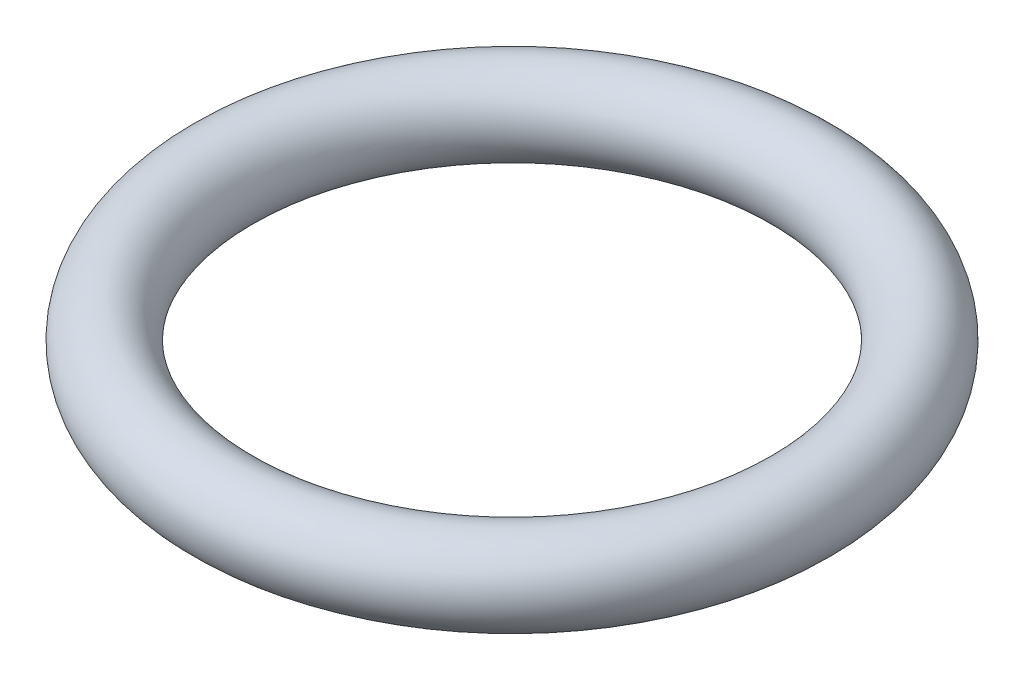
ISO-10303-21;
HEADER;
FILE_DESCRIPTION(('STEP AP214'),'2;1');
FILE_NAME('part.step','',(''),(''),'','','');
FILE_SCHEMA(('AUTOMOTIVE_DESIGN { 1 0 10303 214 1 1 1 1 }'));
ENDSEC;
DATA;
#1=APPLICATION_CONTEXT('core data for automotive mechanical design processes');
#2=APPLICATION_PROTOCOL_DEFINITION('international standard','automotive_design',2000,#1);
#3=PRODUCT_CONTEXT('',#1,'mechanical');
#4=PRODUCT('Part','Part','',(#3));
#5=PRODUCT_RELATED_PRODUCT_CATEGORY('part','',(#4));
#6=PRODUCT_DEFINITION_FORMATION('','',#4);
#7=PRODUCT_DEFINITION_CONTEXT('part definition',#1,'design');
#8=PRODUCT_DEFINITION('design','',#6,#7);
#9=PRODUCT_DEFINITION_SHAPE('','',#8);
#10=(LENGTH_UNIT() NAMED_UNIT(*) SI_UNIT(.MILLI.,.METRE.));
#11=(NAMED_UNIT(*) PLANE_ANGLE_UNIT() SI_UNIT($,.RADIAN.));
#12=(NAMED_UNIT(*) SI_UNIT($,.STERADIAN.) SOLID_ANGLE_UNIT());
#13=UNCERTAINTY_MEASURE_WITH_UNIT(LENGTH_MEASURE(1.E-05),#10,'distance_accuracy_value','');
#14=(GEOMETRIC_REPRESENTATION_CONTEXT(3) GLOBAL_UNCERTAINTY_ASSIGNED_CONTEXT((#13)) GLOBAL_UNIT_ASSIGNED_CONTEXT((#10,
#11,#12)) REPRESENTATION_CONTEXT('',''));
#15=CARTESIAN_POINT('',(0.,0.,0.));
#16=DIRECTION('',(0.,0.,1.));
#17=DIRECTION('',(1.,0.,0.));
#18=AXIS2_PLACEMENT_3D('',#15,#16,#17);
#19=CARTESIAN_POINT('',(0.,0.,0.));
#20=DIRECTION('',(0.,-1.,0.));
#21=DIRECTION('',(1.,0.,0.));
#22=AXIS2_PLACEMENT_3D('',#19,#20,#21);
#23=TOROIDAL_SURFACE('',#22,17.5,2.5);
#24=CARTESIAN_POINT('',(20.0000000000001,0.,0.));
#25=VERTEX_POINT('',#24);
#26=VERTEX_LOOP('',#25);
#27=FACE_BOUND('',#26,.T.);
#28=ADVANCED_FACE('F28',(#27),#23,.T.);
#29=CLOSED_SHELL('',(#28));
#30=MANIFOLD_SOLID_BREP('B2',#29);
#31=ADVANCED_BREP_SHAPE_REPRESENTATION('',(#18,#30),#14);
#32=SHAPE_DEFINITION_REPRESENTATION(#9,#31);
ENDSEC;
END-ISO-10303-21;
